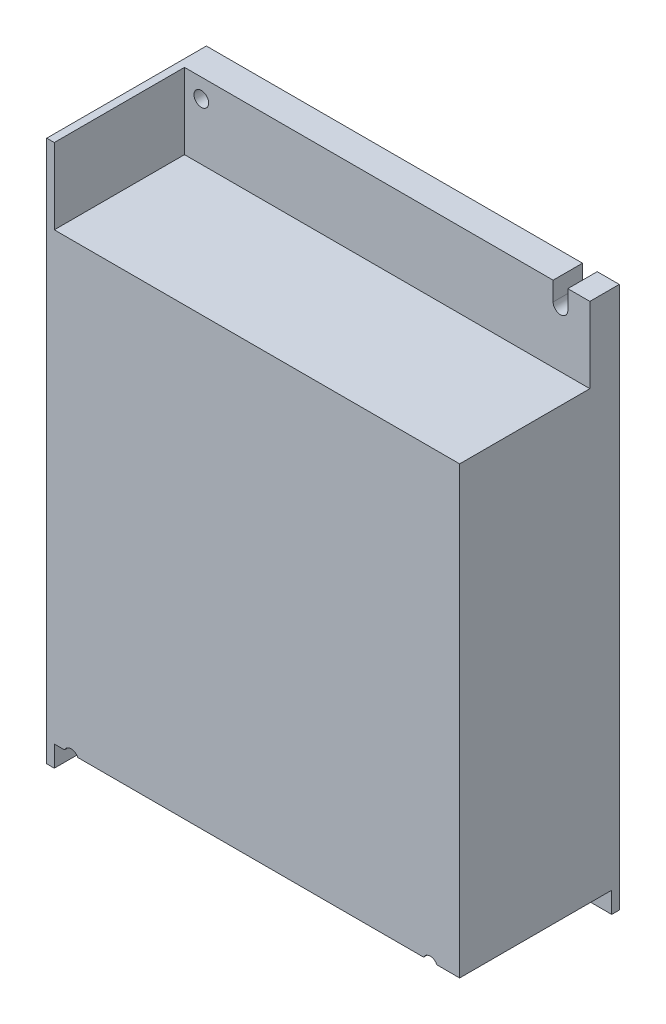
ISO-10303-21;
HEADER;
FILE_DESCRIPTION(('STEP AP214'),'2;1');
FILE_NAME('part.step','',(''),(''),'','','');
FILE_SCHEMA(('AUTOMOTIVE_DESIGN { 1 0 10303 214 1 1 1 1 }'));
ENDSEC;
DATA;
#1=APPLICATION_CONTEXT('core data for automotive mechanical design processes');
#2=APPLICATION_PROTOCOL_DEFINITION('international standard','automotive_design',2000,#1);
#3=PRODUCT_CONTEXT('',#1,'mechanical');
#4=PRODUCT('Part','Part','',(#3));
#5=PRODUCT_RELATED_PRODUCT_CATEGORY('part','',(#4));
#6=PRODUCT_DEFINITION_FORMATION('','',#4);
#7=PRODUCT_DEFINITION_CONTEXT('part definition',#1,'design');
#8=PRODUCT_DEFINITION('design','',#6,#7);
#9=PRODUCT_DEFINITION_SHAPE('','',#8);
#10=(LENGTH_UNIT() NAMED_UNIT(*) SI_UNIT(.MILLI.,.METRE.));
#11=(NAMED_UNIT(*) PLANE_ANGLE_UNIT() SI_UNIT($,.RADIAN.));
#12=(NAMED_UNIT(*) SI_UNIT($,.STERADIAN.) SOLID_ANGLE_UNIT());
#13=UNCERTAINTY_MEASURE_WITH_UNIT(LENGTH_MEASURE(1.E-05),#10,'distance_accuracy_value','');
#14=(GEOMETRIC_REPRESENTATION_CONTEXT(3) GLOBAL_UNCERTAINTY_ASSIGNED_CONTEXT((#13)) GLOBAL_UNIT_ASSIGNED_CONTEXT((#10,
#11,#12)) REPRESENTATION_CONTEXT('',''));
#15=CARTESIAN_POINT('',(0.,0.,0.));
#16=DIRECTION('',(0.,0.,1.));
#17=DIRECTION('',(1.,0.,0.));
#18=AXIS2_PLACEMENT_3D('',#15,#16,#17);
#19=CARTESIAN_POINT('',(-47.35,-59.5,-96.6294468575703));
#20=DIRECTION('',(0.,1.,0.));
#21=DIRECTION('',(-1.,0.,0.));
#22=AXIS2_PLACEMENT_3D('',#19,#20,#21);
#23=PLANE('',#22);
#24=DIRECTION('',(-1.,0.,0.));
#25=VECTOR('',#24,1.);
#26=CARTESIAN_POINT('',(-47.35,-59.5,38.));
#27=LINE('',#26,#25);
#28=CARTESIAN_POINT('',(40.5688611699158,-59.5,38.));
#29=VERTEX_POINT('',#28);
#30=CARTESIAN_POINT('',(-41.7688611699158,-59.5,38.));
#31=VERTEX_POINT('',#30);
#32=EDGE_CURVE('E315',#29,#31,#27,.T.);
#33=ORIENTED_EDGE('',*,*,#32,.T.);
#34=DIRECTION('',(0.,0.,-1.));
#35=VECTOR('',#34,1.);
#36=CARTESIAN_POINT('',(-41.7688611699158,-59.5,38.));
#37=LINE('',#36,#35);
#38=CARTESIAN_POINT('',(-41.7688611699158,-59.5,1.8));
#39=VERTEX_POINT('',#38);
#40=EDGE_CURVE('E12',#31,#39,#37,.T.);
#41=ORIENTED_EDGE('',*,*,#40,.T.);
#42=DIRECTION('',(1.,0.,0.));
#43=VECTOR('',#42,1.);
#44=CARTESIAN_POINT('',(-47.35,-59.5,1.8));
#45=LINE('',#44,#43);
#46=CARTESIAN_POINT('',(40.5688611699158,-59.5,1.8));
#47=VERTEX_POINT('',#46);
#48=EDGE_CURVE('E305',#39,#47,#45,.T.);
#49=ORIENTED_EDGE('',*,*,#48,.T.);
#50=DIRECTION('',(0.,0.,-1.));
#51=VECTOR('',#50,1.);
#52=CARTESIAN_POINT('',(40.5688611699158,-59.5,38.));
#53=LINE('',#52,#51);
#54=EDGE_CURVE('E280',#47,#29,#53,.F.);
#55=ORIENTED_EDGE('',*,*,#54,.T.);
#56=EDGE_LOOP('',(#33,#41,#49,#55));
#57=FACE_BOUND('',#56,.T.);
#58=ADVANCED_FACE('F37',(#57),#23,.F.);
#59=CARTESIAN_POINT('',(-49.15,64.5,38.));
#60=DIRECTION('',(0.,-1.,0.));
#61=DIRECTION('',(0.,0.,-1.));
#62=AXIS2_PLACEMENT_3D('',#59,#60,#61);
#63=PLANE('',#62);
#64=DIRECTION('',(-1.,0.,0.));
#65=VECTOR('',#64,1.);
#66=CARTESIAN_POINT('',(-49.15,64.5,0.));
#67=LINE('',#66,#65);
#68=CARTESIAN_POINT('',(49.15,64.5,0.));
#69=VERTEX_POINT('',#68);
#70=CARTESIAN_POINT('',(43.9,64.5,0.));
#71=VERTEX_POINT('',#70);
#72=EDGE_CURVE('E364',#69,#71,#67,.T.);
#73=ORIENTED_EDGE('',*,*,#72,.T.);
#74=DIRECTION('',(0.,0.,-1.));
#75=VECTOR('',#74,1.);
#76=CARTESIAN_POINT('',(43.9,64.5,38.));
#77=LINE('',#76,#75);
#78=CARTESIAN_POINT('',(43.9,64.5,7.));
#79=VERTEX_POINT('',#78);
#80=EDGE_CURVE('E261',#79,#71,#77,.T.);
#81=ORIENTED_EDGE('',*,*,#80,.F.);
#82=DIRECTION('',(1.,0.,0.));
#83=VECTOR('',#82,1.);
#84=CARTESIAN_POINT('',(-47.35,64.5,7.00000000000001));
#85=LINE('',#84,#83);
#86=CARTESIAN_POINT('',(49.15,64.5,7.00000000000001));
#87=VERTEX_POINT('',#86);
#88=EDGE_CURVE('E329',#79,#87,#85,.T.);
#89=ORIENTED_EDGE('',*,*,#88,.T.);
#90=DIRECTION('',(0.,0.,-1.));
#91=VECTOR('',#90,1.);
#92=CARTESIAN_POINT('',(49.15,64.5,38.));
#93=LINE('',#92,#91);
#94=EDGE_CURVE('E380',#87,#69,#93,.T.);
#95=ORIENTED_EDGE('',*,*,#94,.T.);
#96=EDGE_LOOP('',(#73,#81,#89,#95));
#97=FACE_BOUND('',#96,.T.);
#98=ADVANCED_FACE('F485',(#97),#63,.F.);
#99=CARTESIAN_POINT('',(-49.15,-64.5,38.));
#100=DIRECTION('',(0.,1.,0.));
#101=DIRECTION('',(0.,0.,1.));
#102=AXIS2_PLACEMENT_3D('',#99,#100,#101);
#103=PLANE('',#102);
#104=DIRECTION('',(1.,0.,0.));
#105=VECTOR('',#104,1.);
#106=CARTESIAN_POINT('',(-49.15,-64.5,0.));
#107=LINE('',#106,#105);
#108=CARTESIAN_POINT('',(-49.15,-64.5,0.));
#109=VERTEX_POINT('',#108);
#110=CARTESIAN_POINT('',(40.4,-64.5,0.));
#111=VERTEX_POINT('',#110);
#112=EDGE_CURVE('E353',#109,#111,#107,.T.);
#113=ORIENTED_EDGE('',*,*,#112,.T.);
#114=DIRECTION('',(0.,0.,-1.));
#115=VECTOR('',#114,1.);
#116=CARTESIAN_POINT('',(40.4,-64.5,38.));
#117=LINE('',#116,#115);
#118=CARTESIAN_POINT('',(40.4,-64.5,1.8));
#119=VERTEX_POINT('',#118);
#120=EDGE_CURVE('E281',#119,#111,#117,.T.);
#121=ORIENTED_EDGE('',*,*,#120,.F.);
#122=DIRECTION('',(-1.,0.,0.));
#123=VECTOR('',#122,1.);
#124=CARTESIAN_POINT('',(-47.35,-64.5,1.8));
#125=LINE('',#124,#123);
#126=CARTESIAN_POINT('',(-47.35,-64.5,1.8));
#127=VERTEX_POINT('',#126);
#128=EDGE_CURVE('E307',#119,#127,#125,.T.);
#129=ORIENTED_EDGE('',*,*,#128,.T.);
#130=DIRECTION('',(0.,0.,1.));
#131=VECTOR('',#130,1.);
#132=CARTESIAN_POINT('',(-47.35,-64.5,-96.6294468575703));
#133=LINE('',#132,#131);
#134=CARTESIAN_POINT('',(-47.35,-64.5,38.));
#135=VERTEX_POINT('',#134);
#136=EDGE_CURVE('E314',#127,#135,#133,.T.);
#137=ORIENTED_EDGE('',*,*,#136,.T.);
#138=DIRECTION('',(1.,0.,0.));
#139=VECTOR('',#138,1.);
#140=CARTESIAN_POINT('',(-49.15,-64.5,38.));
#141=LINE('',#140,#139);
#142=CARTESIAN_POINT('',(-49.15,-64.5,38.));
#143=VERTEX_POINT('',#142);
#144=EDGE_CURVE('E357',#143,#135,#141,.T.);
#145=ORIENTED_EDGE('',*,*,#144,.F.);
#146=DIRECTION('',(0.,0.,-1.));
#147=VECTOR('',#146,1.);
#148=CARTESIAN_POINT('',(-49.15,-64.5,38.));
#149=LINE('',#148,#147);
#150=EDGE_CURVE('E374',#143,#109,#149,.T.);
#151=ORIENTED_EDGE('',*,*,#150,.T.);
#152=EDGE_LOOP('',(#113,#121,#129,#137,#145,#151));
#153=FACE_BOUND('',#152,.T.);
#154=ADVANCED_FACE('F442',(#153),#103,.F.);
#155=CARTESIAN_POINT('',(49.15,-59.5,38.));
#156=VERTEX_POINT('',#155);
#157=CARTESIAN_POINT('',(43.7311388300842,-59.5,38.));
#158=VERTEX_POINT('',#157);
#159=EDGE_CURVE('E311',#156,#158,#27,.T.);
#160=ORIENTED_EDGE('',*,*,#159,.T.);
#161=DIRECTION('',(0.,0.,-1.));
#162=VECTOR('',#161,1.);
#163=CARTESIAN_POINT('',(43.7311388300842,-59.5,38.));
#164=LINE('',#163,#162);
#165=CARTESIAN_POINT('',(43.7311388300842,-59.5,1.8));
#166=VERTEX_POINT('',#165);
#167=EDGE_CURVE('E289',#158,#166,#164,.T.);
#168=ORIENTED_EDGE('',*,*,#167,.T.);
#169=CARTESIAN_POINT('',(49.15,-59.5,1.8));
#170=VERTEX_POINT('',#169);
#171=EDGE_CURVE('E299',#166,#170,#45,.T.);
#172=ORIENTED_EDGE('',*,*,#171,.T.);
#173=DIRECTION('',(0.,0.,1.));
#174=VECTOR('',#173,1.);
#175=CARTESIAN_POINT('',(49.15,-59.5,-96.6294468575703));
#176=LINE('',#175,#174);
#177=EDGE_CURVE('E318',#170,#156,#176,.T.);
#178=ORIENTED_EDGE('',*,*,#177,.T.);
#179=EDGE_LOOP('',(#160,#168,#172,#178));
#180=FACE_BOUND('',#179,.T.);
#181=ADVANCED_FACE('F413',(#180),#23,.F.);
#182=CARTESIAN_POINT('',(0.,0.,1.8));
#183=DIRECTION('',(0.,0.,1.));
#184=DIRECTION('',(1.,0.,0.));
#185=AXIS2_PLACEMENT_3D('',#182,#183,#184);
#186=PLANE('',#185);
#187=CARTESIAN_POINT('',(-43.35,-60.25,1.8));
#188=DIRECTION('',(0.,0.,1.));
#189=DIRECTION('',(1.,0.,0.));
#190=AXIS2_PLACEMENT_3D('',#187,#188,#189);
#191=CIRCLE('',#190,1.75);
#192=CARTESIAN_POINT('',(-41.6,-60.25,1.8));
#193=VERTEX_POINT('',#192);
#194=EDGE_CURVE('E242',#193,#39,#191,.T.);
#195=ORIENTED_EDGE('',*,*,#194,.F.);
#196=DIRECTION('',(0.,1.,0.));
#197=VECTOR('',#196,1.);
#198=CARTESIAN_POINT('',(-41.6,0.,1.8));
#199=LINE('',#198,#197);
#200=CARTESIAN_POINT('',(-41.6,-61.5,1.8));
#201=VERTEX_POINT('',#200);
#202=EDGE_CURVE('E245',#201,#193,#199,.T.);
#203=ORIENTED_EDGE('',*,*,#202,.F.);
#204=CARTESIAN_POINT('',(-43.35,-61.5,1.8));
#205=DIRECTION('',(0.,0.,1.));
#206=DIRECTION('',(1.,0.,0.));
#207=AXIS2_PLACEMENT_3D('',#204,#205,#206);
#208=CIRCLE('',#207,1.75);
#209=CARTESIAN_POINT('',(-45.1,-61.5,1.8));
#210=VERTEX_POINT('',#209);
#211=EDGE_CURVE('E247',#210,#201,#208,.T.);
#212=ORIENTED_EDGE('',*,*,#211,.F.);
#213=DIRECTION('',(0.,-1.,0.));
#214=VECTOR('',#213,1.);
#215=CARTESIAN_POINT('',(-45.1,0.,1.8));
#216=LINE('',#215,#214);
#217=CARTESIAN_POINT('',(-45.1,-60.25,1.8));
#218=VERTEX_POINT('',#217);
#219=EDGE_CURVE('E243',#218,#210,#216,.T.);
#220=ORIENTED_EDGE('',*,*,#219,.F.);
#221=CARTESIAN_POINT('',(-44.9311388300842,-59.5,1.8));
#222=VERTEX_POINT('',#221);
#223=EDGE_CURVE('E218',#222,#218,#191,.T.);
#224=ORIENTED_EDGE('',*,*,#223,.F.);
#225=CARTESIAN_POINT('',(-47.35,-59.5,1.8));
#226=VERTEX_POINT('',#225);
#227=EDGE_CURVE('E301',#226,#222,#45,.T.);
#228=ORIENTED_EDGE('',*,*,#227,.F.);
#229=DIRECTION('',(0.,1.,0.));
#230=VECTOR('',#229,1.);
#231=CARTESIAN_POINT('',(-47.35,-59.5,1.8));
#232=LINE('',#231,#230);
#233=EDGE_CURVE('E304',#127,#226,#232,.T.);
#234=ORIENTED_EDGE('',*,*,#233,.F.);
#235=ORIENTED_EDGE('',*,*,#128,.F.);
#236=DIRECTION('',(0.,-1.,0.));
#237=VECTOR('',#236,1.);
#238=CARTESIAN_POINT('',(40.4,0.,1.8));
#239=LINE('',#238,#237);
#240=CARTESIAN_POINT('',(40.4,-60.25,1.8));
#241=VERTEX_POINT('',#240);
#242=EDGE_CURVE('E388',#241,#119,#239,.T.);
#243=ORIENTED_EDGE('',*,*,#242,.F.);
#244=CARTESIAN_POINT('',(42.15,-60.25,1.8));
#245=DIRECTION('',(0.,0.,1.));
#246=DIRECTION('',(1.,0.,0.));
#247=AXIS2_PLACEMENT_3D('',#244,#245,#246);
#248=CIRCLE('',#247,1.75);
#249=EDGE_CURVE('E389',#47,#241,#248,.T.);
#250=ORIENTED_EDGE('',*,*,#249,.F.);
#251=ORIENTED_EDGE('',*,*,#48,.F.);
#252=EDGE_LOOP('',(#195,#203,#212,#220,#224,#228,#234,#235,#243,#250,#251));
#253=FACE_BOUND('',#252,.T.);
#254=ADVANCED_FACE('F452',(#253),#186,.T.);
#255=CARTESIAN_POINT('',(49.15,64.5,38.));
#256=DIRECTION('',(-1.,0.,0.));
#257=DIRECTION('',(0.,-1.,0.));
#258=AXIS2_PLACEMENT_3D('',#255,#256,#257);
#259=PLANE('',#258);
#260=DIRECTION('',(0.,1.,0.));
#261=VECTOR('',#260,1.);
#262=CARTESIAN_POINT('',(49.15,64.5,38.));
#263=LINE('',#262,#261);
#264=CARTESIAN_POINT('',(49.15,46.5,38.));
#265=VERTEX_POINT('',#264);
#266=EDGE_CURVE('E350',#156,#265,#263,.T.);
#267=ORIENTED_EDGE('',*,*,#266,.F.);
#268=ORIENTED_EDGE('',*,*,#177,.F.);
#269=DIRECTION('',(0.,-1.,0.));
#270=VECTOR('',#269,1.);
#271=CARTESIAN_POINT('',(49.15,-59.5,1.8));
#272=LINE('',#271,#270);
#273=CARTESIAN_POINT('',(49.15,-64.5,1.8));
#274=VERTEX_POINT('',#273);
#275=EDGE_CURVE('E296',#170,#274,#272,.T.);
#276=ORIENTED_EDGE('',*,*,#275,.T.);
#277=DIRECTION('',(0.,0.,-1.));
#278=VECTOR('',#277,1.);
#279=CARTESIAN_POINT('',(49.15,-64.5,38.));
#280=LINE('',#279,#278);
#281=CARTESIAN_POINT('',(49.15,-64.5,0.));
#282=VERTEX_POINT('',#281);
#283=EDGE_CURVE('E360',#274,#282,#280,.T.);
#284=ORIENTED_EDGE('',*,*,#283,.T.);
#285=DIRECTION('',(0.,1.,0.));
#286=VECTOR('',#285,1.);
#287=CARTESIAN_POINT('',(49.15,64.5,0.));
#288=LINE('',#287,#286);
#289=EDGE_CURVE('E349',#282,#69,#288,.T.);
#290=ORIENTED_EDGE('',*,*,#289,.T.);
#291=ORIENTED_EDGE('',*,*,#94,.F.);
#292=DIRECTION('',(0.,-1.,0.));
#293=VECTOR('',#292,1.);
#294=CARTESIAN_POINT('',(49.15,64.5,7.00000000000001));
#295=LINE('',#294,#293);
#296=CARTESIAN_POINT('',(49.15,46.5,7.00000000000001));
#297=VERTEX_POINT('',#296);
#298=EDGE_CURVE('E326',#87,#297,#295,.T.);
#299=ORIENTED_EDGE('',*,*,#298,.T.);
#300=DIRECTION('',(0.,0.,1.));
#301=VECTOR('',#300,1.);
#302=CARTESIAN_POINT('',(49.15,46.5,-98.1644029167397));
#303=LINE('',#302,#301);
#304=EDGE_CURVE('E343',#297,#265,#303,.T.);
#305=ORIENTED_EDGE('',*,*,#304,.T.);
#306=EDGE_LOOP('',(#267,#268,#276,#284,#290,#291,#299,#305));
#307=FACE_BOUND('',#306,.T.);
#308=ADVANCED_FACE('F39',(#307),#259,.F.);
#309=CARTESIAN_POINT('',(-47.35,64.5,7.00000000000001));
#310=VERTEX_POINT('',#309);
#311=CARTESIAN_POINT('',(40.4,64.5,7.00000000000001));
#312=VERTEX_POINT('',#311);
#313=EDGE_CURVE('E331',#310,#312,#85,.T.);
#314=ORIENTED_EDGE('',*,*,#313,.T.);
#315=DIRECTION('',(0.,0.,-1.));
#316=VECTOR('',#315,1.);
#317=CARTESIAN_POINT('',(40.4,64.5,38.));
#318=LINE('',#317,#316);
#319=CARTESIAN_POINT('',(40.4,64.5,0.));
#320=VERTEX_POINT('',#319);
#321=EDGE_CURVE('E263',#312,#320,#318,.T.);
#322=ORIENTED_EDGE('',*,*,#321,.T.);
#323=CARTESIAN_POINT('',(-49.15,64.5,0.));
#324=VERTEX_POINT('',#323);
#325=EDGE_CURVE('E363',#320,#324,#67,.T.);
#326=ORIENTED_EDGE('',*,*,#325,.T.);
#327=DIRECTION('',(0.,0.,-1.));
#328=VECTOR('',#327,1.);
#329=CARTESIAN_POINT('',(-49.15,64.5,38.));
#330=LINE('',#329,#328);
#331=CARTESIAN_POINT('',(-49.15,64.5,38.));
#332=VERTEX_POINT('',#331);
#333=EDGE_CURVE('E377',#332,#324,#330,.T.);
#334=ORIENTED_EDGE('',*,*,#333,.F.);
#335=DIRECTION('',(-1.,0.,0.));
#336=VECTOR('',#335,1.);
#337=CARTESIAN_POINT('',(-49.15,64.5,38.));
#338=LINE('',#337,#336);
#339=CARTESIAN_POINT('',(-47.35,64.5,38.));
#340=VERTEX_POINT('',#339);
#341=EDGE_CURVE('E352',#340,#332,#338,.T.);
#342=ORIENTED_EDGE('',*,*,#341,.F.);
#343=DIRECTION('',(0.,0.,1.));
#344=VECTOR('',#343,1.);
#345=CARTESIAN_POINT('',(-47.35,64.5,-98.1644029167397));
#346=LINE('',#345,#344);
#347=EDGE_CURVE('E330',#310,#340,#346,.T.);
#348=ORIENTED_EDGE('',*,*,#347,.F.);
#349=EDGE_LOOP('',(#314,#322,#326,#334,#342,#348));
#350=FACE_BOUND('',#349,.T.);
#351=ADVANCED_FACE('F433',(#350),#63,.F.);
#352=CARTESIAN_POINT('',(-49.15,64.5,38.));
#353=DIRECTION('',(1.,0.,0.));
#354=DIRECTION('',(0.,1.,0.));
#355=AXIS2_PLACEMENT_3D('',#352,#353,#354);
#356=PLANE('',#355);
#357=DIRECTION('',(0.,-1.,0.));
#358=VECTOR('',#357,1.);
#359=CARTESIAN_POINT('',(-49.15,64.5,0.));
#360=LINE('',#359,#358);
#361=EDGE_CURVE('E367',#324,#109,#360,.T.);
#362=ORIENTED_EDGE('',*,*,#361,.T.);
#363=ORIENTED_EDGE('',*,*,#150,.F.);
#364=DIRECTION('',(0.,-1.,0.));
#365=VECTOR('',#364,1.);
#366=CARTESIAN_POINT('',(-49.15,64.5,38.));
#367=LINE('',#366,#365);
#368=EDGE_CURVE('E355',#332,#143,#367,.T.);
#369=ORIENTED_EDGE('',*,*,#368,.F.);
#370=ORIENTED_EDGE('',*,*,#333,.T.);
#371=EDGE_LOOP('',(#362,#363,#369,#370));
#372=FACE_BOUND('',#371,.T.);
#373=ADVANCED_FACE('F439',(#372),#356,.F.);
#374=CARTESIAN_POINT('',(43.9,-64.5,1.8));
#375=VERTEX_POINT('',#374);
#376=EDGE_CURVE('E322',#274,#375,#125,.T.);
#377=ORIENTED_EDGE('',*,*,#376,.T.);
#378=DIRECTION('',(0.,0.,-1.));
#379=VECTOR('',#378,1.);
#380=CARTESIAN_POINT('',(43.9,-64.5,38.));
#381=LINE('',#380,#379);
#382=CARTESIAN_POINT('',(43.9,-64.5,0.));
#383=VERTEX_POINT('',#382);
#384=EDGE_CURVE('E283',#375,#383,#381,.T.);
#385=ORIENTED_EDGE('',*,*,#384,.T.);
#386=EDGE_CURVE('E369',#383,#282,#107,.T.);
#387=ORIENTED_EDGE('',*,*,#386,.T.);
#388=ORIENTED_EDGE('',*,*,#283,.F.);
#389=EDGE_LOOP('',(#377,#385,#387,#388));
#390=FACE_BOUND('',#389,.T.);
#391=ADVANCED_FACE('F478',(#390),#103,.F.);
#392=CARTESIAN_POINT('',(0.,0.,38.));
#393=DIRECTION('',(0.,0.,1.));
#394=DIRECTION('',(1.,0.,0.));
#395=AXIS2_PLACEMENT_3D('',#392,#393,#394);
#396=PLANE('',#395);
#397=CARTESIAN_POINT('',(-43.35,-60.25,38.));
#398=DIRECTION('',(0.,0.,-1.));
#399=DIRECTION('',(-1.,0.,0.));
#400=AXIS2_PLACEMENT_3D('',#397,#398,#399);
#401=CIRCLE('',#400,1.75);
#402=CARTESIAN_POINT('',(-44.9311388300842,-59.5,38.));
#403=VERTEX_POINT('',#402);
#404=EDGE_CURVE('E60',#403,#31,#401,.T.);
#405=ORIENTED_EDGE('',*,*,#404,.T.);
#406=ORIENTED_EDGE('',*,*,#32,.F.);
#407=CARTESIAN_POINT('',(42.15,-60.25,38.));
#408=DIRECTION('',(0.,0.,-1.));
#409=DIRECTION('',(-1.,0.,0.));
#410=AXIS2_PLACEMENT_3D('',#407,#408,#409);
#411=CIRCLE('',#410,1.75);
#412=EDGE_CURVE('E267',#29,#158,#411,.T.);
#413=ORIENTED_EDGE('',*,*,#412,.T.);
#414=ORIENTED_EDGE('',*,*,#159,.F.);
#415=ORIENTED_EDGE('',*,*,#266,.T.);
#416=DIRECTION('',(1.,0.,0.));
#417=VECTOR('',#416,1.);
#418=CARTESIAN_POINT('',(-47.35,46.5,38.));
#419=LINE('',#418,#417);
#420=CARTESIAN_POINT('',(-47.35,46.5,38.));
#421=VERTEX_POINT('',#420);
#422=EDGE_CURVE('E338',#421,#265,#419,.T.);
#423=ORIENTED_EDGE('',*,*,#422,.F.);
#424=DIRECTION('',(0.,-1.,0.));
#425=VECTOR('',#424,1.);
#426=CARTESIAN_POINT('',(-47.35,64.5,38.));
#427=LINE('',#426,#425);
#428=EDGE_CURVE('E325',#340,#421,#427,.T.);
#429=ORIENTED_EDGE('',*,*,#428,.F.);
#430=ORIENTED_EDGE('',*,*,#341,.T.);
#431=ORIENTED_EDGE('',*,*,#368,.T.);
#432=ORIENTED_EDGE('',*,*,#144,.T.);
#433=DIRECTION('',(0.,-1.,0.));
#434=VECTOR('',#433,1.);
#435=CARTESIAN_POINT('',(-47.35,-59.5,38.));
#436=LINE('',#435,#434);
#437=CARTESIAN_POINT('',(-47.35,-59.5,38.));
#438=VERTEX_POINT('',#437);
#439=EDGE_CURVE('E308',#438,#135,#436,.T.);
#440=ORIENTED_EDGE('',*,*,#439,.F.);
#441=EDGE_CURVE('E310',#403,#438,#27,.T.);
#442=ORIENTED_EDGE('',*,*,#441,.F.);
#443=EDGE_LOOP('',(#405,#406,#413,#414,#415,#423,#429,#430,#431,#432,#440,#442));
#444=FACE_BOUND('',#443,.T.);
#445=ADVANCED_FACE('F403',(#444),#396,.T.);
#446=CARTESIAN_POINT('',(0.,0.,0.));
#447=DIRECTION('',(0.,0.,1.));
#448=DIRECTION('',(1.,0.,0.));
#449=AXIS2_PLACEMENT_3D('',#446,#447,#448);
#450=PLANE('',#449);
#451=DIRECTION('',(0.,1.,0.));
#452=VECTOR('',#451,1.);
#453=CARTESIAN_POINT('',(-45.1,-61.5,0.));
#454=LINE('',#453,#452);
#455=CARTESIAN_POINT('',(-45.1,-61.5,0.));
#456=VERTEX_POINT('',#455);
#457=CARTESIAN_POINT('',(-45.1,-60.25,0.));
#458=VERTEX_POINT('',#457);
#459=EDGE_CURVE('E225',#456,#458,#454,.T.);
#460=ORIENTED_EDGE('',*,*,#459,.F.);
#461=CARTESIAN_POINT('',(-43.35,-61.5,0.));
#462=DIRECTION('',(0.,0.,-1.));
#463=DIRECTION('',(-1.,0.,0.));
#464=AXIS2_PLACEMENT_3D('',#461,#462,#463);
#465=CIRCLE('',#464,1.75);
#466=CARTESIAN_POINT('',(-41.6,-61.5,0.));
#467=VERTEX_POINT('',#466);
#468=EDGE_CURVE('E52',#467,#456,#465,.T.);
#469=ORIENTED_EDGE('',*,*,#468,.F.);
#470=DIRECTION('',(0.,-1.,0.));
#471=VECTOR('',#470,1.);
#472=CARTESIAN_POINT('',(-41.6,-61.5,0.));
#473=LINE('',#472,#471);
#474=CARTESIAN_POINT('',(-41.6,-60.25,0.));
#475=VERTEX_POINT('',#474);
#476=EDGE_CURVE('E232',#475,#467,#473,.T.);
#477=ORIENTED_EDGE('',*,*,#476,.F.);
#478=CARTESIAN_POINT('',(-43.35,-60.25,0.));
#479=DIRECTION('',(0.,0.,-1.));
#480=DIRECTION('',(-1.,0.,0.));
#481=AXIS2_PLACEMENT_3D('',#478,#479,#480);
#482=CIRCLE('',#481,1.75);
#483=EDGE_CURVE('E215',#458,#475,#482,.T.);
#484=ORIENTED_EDGE('',*,*,#483,.F.);
#485=EDGE_LOOP('',(#460,#469,#477,#484));
#486=FACE_BOUND('',#485,.T.);
#487=CARTESIAN_POINT('',(-43.35,60.,0.));
#488=DIRECTION('',(0.,0.,-1.));
#489=DIRECTION('',(-1.,0.,0.));
#490=AXIS2_PLACEMENT_3D('',#487,#488,#489);
#491=CIRCLE('',#490,1.75);
#492=CARTESIAN_POINT('',(-45.1,60.,0.));
#493=VERTEX_POINT('',#492);
#494=EDGE_CURVE('E292',#493,#493,#491,.T.);
#495=ORIENTED_EDGE('',*,*,#494,.F.);
#496=EDGE_LOOP('',(#495));
#497=FACE_BOUND('',#496,.T.);
#498=CARTESIAN_POINT('',(42.15,60.,0.));
#499=DIRECTION('',(0.,0.,-1.));
#500=DIRECTION('',(1.,0.,0.));
#501=AXIS2_PLACEMENT_3D('',#498,#499,#500);
#502=CIRCLE('',#501,1.75);
#503=CARTESIAN_POINT('',(43.9,60.,0.));
#504=VERTEX_POINT('',#503);
#505=CARTESIAN_POINT('',(40.4,60.,0.));
#506=VERTEX_POINT('',#505);
#507=EDGE_CURVE('E249',#504,#506,#502,.T.);
#508=ORIENTED_EDGE('',*,*,#507,.F.);
#509=DIRECTION('',(0.,-1.,0.));
#510=VECTOR('',#509,1.);
#511=CARTESIAN_POINT('',(43.9,64.5,0.));
#512=LINE('',#511,#510);
#513=EDGE_CURVE('E254',#71,#504,#512,.T.);
#514=ORIENTED_EDGE('',*,*,#513,.F.);
#515=ORIENTED_EDGE('',*,*,#72,.F.);
#516=ORIENTED_EDGE('',*,*,#289,.F.);
#517=ORIENTED_EDGE('',*,*,#386,.F.);
#518=DIRECTION('',(0.,-1.,0.));
#519=VECTOR('',#518,1.);
#520=CARTESIAN_POINT('',(43.9,-64.5,0.));
#521=LINE('',#520,#519);
#522=CARTESIAN_POINT('',(43.9,-60.25,0.));
#523=VERTEX_POINT('',#522);
#524=EDGE_CURVE('E274',#523,#383,#521,.T.);
#525=ORIENTED_EDGE('',*,*,#524,.F.);
#526=CARTESIAN_POINT('',(42.15,-60.25,0.));
#527=DIRECTION('',(0.,0.,-1.));
#528=DIRECTION('',(-1.,0.,0.));
#529=AXIS2_PLACEMENT_3D('',#526,#527,#528);
#530=CIRCLE('',#529,1.75);
#531=CARTESIAN_POINT('',(40.4,-60.25,0.));
#532=VERTEX_POINT('',#531);
#533=EDGE_CURVE('E260',#532,#523,#530,.T.);
#534=ORIENTED_EDGE('',*,*,#533,.F.);
#535=DIRECTION('',(0.,1.,0.));
#536=VECTOR('',#535,1.);
#537=CARTESIAN_POINT('',(40.4,-60.25,0.));
#538=LINE('',#537,#536);
#539=EDGE_CURVE('E271',#111,#532,#538,.T.);
#540=ORIENTED_EDGE('',*,*,#539,.F.);
#541=ORIENTED_EDGE('',*,*,#112,.F.);
#542=ORIENTED_EDGE('',*,*,#361,.F.);
#543=ORIENTED_EDGE('',*,*,#325,.F.);
#544=DIRECTION('',(0.,1.,0.));
#545=VECTOR('',#544,1.);
#546=CARTESIAN_POINT('',(40.4,60.,0.));
#547=LINE('',#546,#545);
#548=EDGE_CURVE('E252',#506,#320,#547,.T.);
#549=ORIENTED_EDGE('',*,*,#548,.F.);
#550=EDGE_LOOP('',(#508,#514,#515,#516,#517,#525,#534,#540,#541,#542,#543,#549));
#551=FACE_BOUND('',#550,.T.);
#552=ADVANCED_FACE('F229',(#486,#497,#551),#450,.F.);
#553=CARTESIAN_POINT('',(-47.35,64.5,-98.1644029167397));
#554=DIRECTION('',(-1.,0.,0.));
#555=DIRECTION('',(0.,-1.,0.));
#556=AXIS2_PLACEMENT_3D('',#553,#554,#555);
#557=PLANE('',#556);
#558=DIRECTION('',(0.,1.,0.));
#559=VECTOR('',#558,1.);
#560=CARTESIAN_POINT('',(-47.35,64.5,7.00000000000001));
#561=LINE('',#560,#559);
#562=CARTESIAN_POINT('',(-47.35,46.5,7.00000000000001));
#563=VERTEX_POINT('',#562);
#564=EDGE_CURVE('E334',#563,#310,#561,.T.);
#565=ORIENTED_EDGE('',*,*,#564,.T.);
#566=ORIENTED_EDGE('',*,*,#347,.T.);
#567=ORIENTED_EDGE('',*,*,#428,.T.);
#568=DIRECTION('',(0.,0.,1.));
#569=VECTOR('',#568,1.);
#570=CARTESIAN_POINT('',(-47.35,46.5,-98.1644029167397));
#571=LINE('',#570,#569);
#572=EDGE_CURVE('E341',#563,#421,#571,.T.);
#573=ORIENTED_EDGE('',*,*,#572,.F.);
#574=EDGE_LOOP('',(#565,#566,#567,#573));
#575=FACE_BOUND('',#574,.T.);
#576=ADVANCED_FACE('F427',(#575),#557,.F.);
#577=CARTESIAN_POINT('',(-47.35,46.5,-98.1644029167397));
#578=DIRECTION('',(0.,-1.,0.));
#579=DIRECTION('',(0.,0.,-1.));
#580=AXIS2_PLACEMENT_3D('',#577,#578,#579);
#581=PLANE('',#580);
#582=DIRECTION('',(-1.,0.,0.));
#583=VECTOR('',#582,1.);
#584=CARTESIAN_POINT('',(-47.35,46.5,7.00000000000001));
#585=LINE('',#584,#583);
#586=EDGE_CURVE('E336',#297,#563,#585,.T.);
#587=ORIENTED_EDGE('',*,*,#586,.T.);
#588=ORIENTED_EDGE('',*,*,#572,.T.);
#589=ORIENTED_EDGE('',*,*,#422,.T.);
#590=ORIENTED_EDGE('',*,*,#304,.F.);
#591=EDGE_LOOP('',(#587,#588,#589,#590));
#592=FACE_BOUND('',#591,.T.);
#593=ADVANCED_FACE('F422',(#592),#581,.F.);
#594=CARTESIAN_POINT('',(0.,0.,7.));
#595=DIRECTION('',(0.,0.,1.));
#596=DIRECTION('',(1.,0.,0.));
#597=AXIS2_PLACEMENT_3D('',#594,#595,#596);
#598=PLANE('',#597);
#599=DIRECTION('',(0.,1.,0.));
#600=VECTOR('',#599,1.);
#601=CARTESIAN_POINT('',(43.9,0.,7.));
#602=LINE('',#601,#600);
#603=CARTESIAN_POINT('',(43.9,60.,7.));
#604=VERTEX_POINT('',#603);
#605=EDGE_CURVE('E395',#604,#79,#602,.T.);
#606=ORIENTED_EDGE('',*,*,#605,.F.);
#607=CARTESIAN_POINT('',(42.15,60.,7.));
#608=DIRECTION('',(0.,0.,1.));
#609=DIRECTION('',(1.,0.,0.));
#610=AXIS2_PLACEMENT_3D('',#607,#608,#609);
#611=CIRCLE('',#610,1.75);
#612=CARTESIAN_POINT('',(40.4,60.,7.));
#613=VERTEX_POINT('',#612);
#614=EDGE_CURVE('E393',#613,#604,#611,.T.);
#615=ORIENTED_EDGE('',*,*,#614,.F.);
#616=DIRECTION('',(0.,-1.,0.));
#617=VECTOR('',#616,1.);
#618=CARTESIAN_POINT('',(40.4,0.,7.));
#619=LINE('',#618,#617);
#620=EDGE_CURVE('E391',#312,#613,#619,.T.);
#621=ORIENTED_EDGE('',*,*,#620,.F.);
#622=ORIENTED_EDGE('',*,*,#313,.F.);
#623=ORIENTED_EDGE('',*,*,#564,.F.);
#624=ORIENTED_EDGE('',*,*,#586,.F.);
#625=ORIENTED_EDGE('',*,*,#298,.F.);
#626=ORIENTED_EDGE('',*,*,#88,.F.);
#627=EDGE_LOOP('',(#606,#615,#621,#622,#623,#624,#625,#626));
#628=FACE_BOUND('',#627,.T.);
#629=CARTESIAN_POINT('',(-43.35,60.,7.));
#630=DIRECTION('',(0.,0.,1.));
#631=DIRECTION('',(1.,0.,0.));
#632=AXIS2_PLACEMENT_3D('',#629,#630,#631);
#633=CIRCLE('',#632,1.75);
#634=CARTESIAN_POINT('',(-41.6,60.,7.));
#635=VERTEX_POINT('',#634);
#636=EDGE_CURVE('E295',#635,#635,#633,.T.);
#637=ORIENTED_EDGE('',*,*,#636,.F.);
#638=EDGE_LOOP('',(#637));
#639=FACE_BOUND('',#638,.T.);
#640=ADVANCED_FACE('F490',(#628,#639),#598,.T.);
#641=CARTESIAN_POINT('',(-47.35,-59.5,-96.6294468575703));
#642=DIRECTION('',(-1.,0.,0.));
#643=DIRECTION('',(0.,0.,1.));
#644=AXIS2_PLACEMENT_3D('',#641,#642,#643);
#645=PLANE('',#644);
#646=ORIENTED_EDGE('',*,*,#233,.T.);
#647=DIRECTION('',(0.,0.,1.));
#648=VECTOR('',#647,1.);
#649=CARTESIAN_POINT('',(-47.35,-59.5,-96.6294468575703));
#650=LINE('',#649,#648);
#651=EDGE_CURVE('E300',#226,#438,#650,.T.);
#652=ORIENTED_EDGE('',*,*,#651,.T.);
#653=ORIENTED_EDGE('',*,*,#439,.T.);
#654=ORIENTED_EDGE('',*,*,#136,.F.);
#655=EDGE_LOOP('',(#646,#652,#653,#654));
#656=FACE_BOUND('',#655,.T.);
#657=ADVANCED_FACE('F449',(#656),#645,.F.);
#658=ORIENTED_EDGE('',*,*,#227,.T.);
#659=DIRECTION('',(0.,0.,-1.));
#660=VECTOR('',#659,1.);
#661=CARTESIAN_POINT('',(-44.9311388300842,-59.5,38.));
#662=LINE('',#661,#660);
#663=EDGE_CURVE('E45',#222,#403,#662,.F.);
#664=ORIENTED_EDGE('',*,*,#663,.T.);
#665=ORIENTED_EDGE('',*,*,#441,.T.);
#666=ORIENTED_EDGE('',*,*,#651,.F.);
#667=EDGE_LOOP('',(#658,#664,#665,#666));
#668=FACE_BOUND('',#667,.T.);
#669=ADVANCED_FACE('F398',(#668),#23,.F.);
#670=CARTESIAN_POINT('',(43.9,-60.25,1.8));
#671=VERTEX_POINT('',#670);
#672=EDGE_CURVE('E386',#671,#166,#248,.T.);
#673=ORIENTED_EDGE('',*,*,#672,.F.);
#674=DIRECTION('',(0.,1.,0.));
#675=VECTOR('',#674,1.);
#676=CARTESIAN_POINT('',(43.9,0.,1.8));
#677=LINE('',#676,#675);
#678=EDGE_CURVE('E382',#375,#671,#677,.T.);
#679=ORIENTED_EDGE('',*,*,#678,.F.);
#680=ORIENTED_EDGE('',*,*,#376,.F.);
#681=ORIENTED_EDGE('',*,*,#275,.F.);
#682=ORIENTED_EDGE('',*,*,#171,.F.);
#683=EDGE_LOOP('',(#673,#679,#680,#681,#682));
#684=FACE_BOUND('',#683,.T.);
#685=ADVANCED_FACE('F476',(#684),#186,.T.);
#686=CARTESIAN_POINT('',(-43.35,60.,38.));
#687=DIRECTION('',(0.,0.,-1.));
#688=DIRECTION('',(-1.,0.,0.));
#689=AXIS2_PLACEMENT_3D('',#686,#687,#688);
#690=CYLINDRICAL_SURFACE('',#689,1.75);
#691=ORIENTED_EDGE('',*,*,#636,.T.);
#692=EDGE_LOOP('',(#691));
#693=FACE_BOUND('',#692,.T.);
#694=ORIENTED_EDGE('',*,*,#494,.T.);
#695=EDGE_LOOP('',(#694));
#696=FACE_BOUND('',#695,.T.);
#697=ADVANCED_FACE('F526',(#693,#696),#690,.F.);
#698=CARTESIAN_POINT('',(42.15,-60.25,38.));
#699=DIRECTION('',(0.,0.,-1.));
#700=DIRECTION('',(-1.,0.,0.));
#701=AXIS2_PLACEMENT_3D('',#698,#699,#700);
#702=CYLINDRICAL_SURFACE('',#701,1.75);
#703=ORIENTED_EDGE('',*,*,#412,.F.);
#704=ORIENTED_EDGE('',*,*,#54,.F.);
#705=ORIENTED_EDGE('',*,*,#249,.T.);
#706=DIRECTION('',(0.,0.,-1.));
#707=VECTOR('',#706,1.);
#708=CARTESIAN_POINT('',(40.4,-60.25,38.));
#709=LINE('',#708,#707);
#710=EDGE_CURVE('E278',#241,#532,#709,.T.);
#711=ORIENTED_EDGE('',*,*,#710,.T.);
#712=ORIENTED_EDGE('',*,*,#533,.T.);
#713=DIRECTION('',(0.,0.,-1.));
#714=VECTOR('',#713,1.);
#715=CARTESIAN_POINT('',(43.9,-60.25,38.));
#716=LINE('',#715,#714);
#717=EDGE_CURVE('E270',#671,#523,#716,.T.);
#718=ORIENTED_EDGE('',*,*,#717,.F.);
#719=ORIENTED_EDGE('',*,*,#672,.T.);
#720=ORIENTED_EDGE('',*,*,#167,.F.);
#721=EDGE_LOOP('',(#703,#704,#705,#711,#712,#718,#719,#720));
#722=FACE_BOUND('',#721,.T.);
#723=ADVANCED_FACE('F461',(#722),#702,.F.);
#724=CARTESIAN_POINT('',(40.4,-60.25,38.));
#725=DIRECTION('',(-1.,0.,0.));
#726=DIRECTION('',(0.,0.,1.));
#727=AXIS2_PLACEMENT_3D('',#724,#725,#726);
#728=PLANE('',#727);
#729=ORIENTED_EDGE('',*,*,#242,.T.);
#730=ORIENTED_EDGE('',*,*,#120,.T.);
#731=ORIENTED_EDGE('',*,*,#539,.T.);
#732=ORIENTED_EDGE('',*,*,#710,.F.);
#733=EDGE_LOOP('',(#729,#730,#731,#732));
#734=FACE_BOUND('',#733,.T.);
#735=ADVANCED_FACE('F464',(#734),#728,.F.);
#736=CARTESIAN_POINT('',(43.9,-64.5,38.));
#737=DIRECTION('',(1.,0.,0.));
#738=DIRECTION('',(0.,0.,-1.));
#739=AXIS2_PLACEMENT_3D('',#736,#737,#738);
#740=PLANE('',#739);
#741=ORIENTED_EDGE('',*,*,#678,.T.);
#742=ORIENTED_EDGE('',*,*,#717,.T.);
#743=ORIENTED_EDGE('',*,*,#524,.T.);
#744=ORIENTED_EDGE('',*,*,#384,.F.);
#745=EDGE_LOOP('',(#741,#742,#743,#744));
#746=FACE_BOUND('',#745,.T.);
#747=ADVANCED_FACE('F510',(#746),#740,.F.);
#748=CARTESIAN_POINT('',(42.15,60.,38.));
#749=DIRECTION('',(0.,0.,-1.));
#750=DIRECTION('',(-1.,0.,0.));
#751=AXIS2_PLACEMENT_3D('',#748,#749,#750);
#752=CYLINDRICAL_SURFACE('',#751,1.75);
#753=ORIENTED_EDGE('',*,*,#614,.T.);
#754=DIRECTION('',(0.,0.,-1.));
#755=VECTOR('',#754,1.);
#756=CARTESIAN_POINT('',(43.9,60.,38.));
#757=LINE('',#756,#755);
#758=EDGE_CURVE('E258',#604,#504,#757,.T.);
#759=ORIENTED_EDGE('',*,*,#758,.T.);
#760=ORIENTED_EDGE('',*,*,#507,.T.);
#761=DIRECTION('',(0.,0.,-1.));
#762=VECTOR('',#761,1.);
#763=CARTESIAN_POINT('',(40.4,60.,38.));
#764=LINE('',#763,#762);
#765=EDGE_CURVE('E257',#613,#506,#764,.T.);
#766=ORIENTED_EDGE('',*,*,#765,.F.);
#767=EDGE_LOOP('',(#753,#759,#760,#766));
#768=FACE_BOUND('',#767,.T.);
#769=ADVANCED_FACE('F499',(#768),#752,.F.);
#770=CARTESIAN_POINT('',(43.9,64.5,38.));
#771=DIRECTION('',(1.,0.,0.));
#772=DIRECTION('',(0.,0.,-1.));
#773=AXIS2_PLACEMENT_3D('',#770,#771,#772);
#774=PLANE('',#773);
#775=ORIENTED_EDGE('',*,*,#605,.T.);
#776=ORIENTED_EDGE('',*,*,#80,.T.);
#777=ORIENTED_EDGE('',*,*,#513,.T.);
#778=ORIENTED_EDGE('',*,*,#758,.F.);
#779=EDGE_LOOP('',(#775,#776,#777,#778));
#780=FACE_BOUND('',#779,.T.);
#781=ADVANCED_FACE('F502',(#780),#774,.F.);
#782=CARTESIAN_POINT('',(40.4,60.,38.));
#783=DIRECTION('',(-1.,0.,0.));
#784=DIRECTION('',(0.,0.,1.));
#785=AXIS2_PLACEMENT_3D('',#782,#783,#784);
#786=PLANE('',#785);
#787=ORIENTED_EDGE('',*,*,#620,.T.);
#788=ORIENTED_EDGE('',*,*,#765,.T.);
#789=ORIENTED_EDGE('',*,*,#548,.T.);
#790=ORIENTED_EDGE('',*,*,#321,.F.);
#791=EDGE_LOOP('',(#787,#788,#789,#790));
#792=FACE_BOUND('',#791,.T.);
#793=ADVANCED_FACE('F496',(#792),#786,.F.);
#794=CARTESIAN_POINT('',(-43.35,-61.5,38.));
#795=DIRECTION('',(0.,0.,-1.));
#796=DIRECTION('',(-1.,0.,0.));
#797=AXIS2_PLACEMENT_3D('',#794,#795,#796);
#798=CYLINDRICAL_SURFACE('',#797,1.75);
#799=ORIENTED_EDGE('',*,*,#211,.T.);
#800=DIRECTION('',(0.,0.,-1.));
#801=VECTOR('',#800,1.);
#802=CARTESIAN_POINT('',(-41.6,-61.5,38.));
#803=LINE('',#802,#801);
#804=EDGE_CURVE('E237',#201,#467,#803,.T.);
#805=ORIENTED_EDGE('',*,*,#804,.T.);
#806=ORIENTED_EDGE('',*,*,#468,.T.);
#807=DIRECTION('',(0.,0.,-1.));
#808=VECTOR('',#807,1.);
#809=CARTESIAN_POINT('',(-45.1,-61.5,38.));
#810=LINE('',#809,#808);
#811=EDGE_CURVE('E222',#210,#456,#810,.T.);
#812=ORIENTED_EDGE('',*,*,#811,.F.);
#813=EDGE_LOOP('',(#799,#805,#806,#812));
#814=FACE_BOUND('',#813,.T.);
#815=ADVANCED_FACE('F455',(#814),#798,.F.);
#816=CARTESIAN_POINT('',(-41.6,-61.5,38.));
#817=DIRECTION('',(1.,0.,0.));
#818=DIRECTION('',(0.,0.,-1.));
#819=AXIS2_PLACEMENT_3D('',#816,#817,#818);
#820=PLANE('',#819);
#821=ORIENTED_EDGE('',*,*,#202,.T.);
#822=DIRECTION('',(0.,0.,-1.));
#823=VECTOR('',#822,1.);
#824=CARTESIAN_POINT('',(-41.6,-60.25,38.));
#825=LINE('',#824,#823);
#826=EDGE_CURVE('E221',#193,#475,#825,.T.);
#827=ORIENTED_EDGE('',*,*,#826,.T.);
#828=ORIENTED_EDGE('',*,*,#476,.T.);
#829=ORIENTED_EDGE('',*,*,#804,.F.);
#830=EDGE_LOOP('',(#821,#827,#828,#829));
#831=FACE_BOUND('',#830,.T.);
#832=ADVANCED_FACE('F458',(#831),#820,.F.);
#833=CARTESIAN_POINT('',(-43.35,-60.25,38.));
#834=DIRECTION('',(0.,0.,-1.));
#835=DIRECTION('',(-1.,0.,0.));
#836=AXIS2_PLACEMENT_3D('',#833,#834,#835);
#837=CYLINDRICAL_SURFACE('',#836,1.75);
#838=ORIENTED_EDGE('',*,*,#194,.T.);
#839=ORIENTED_EDGE('',*,*,#40,.F.);
#840=ORIENTED_EDGE('',*,*,#404,.F.);
#841=ORIENTED_EDGE('',*,*,#663,.F.);
#842=ORIENTED_EDGE('',*,*,#223,.T.);
#843=DIRECTION('',(0.,0.,-1.));
#844=VECTOR('',#843,1.);
#845=CARTESIAN_POINT('',(-45.1,-60.25,38.));
#846=LINE('',#845,#844);
#847=EDGE_CURVE('E210',#218,#458,#846,.T.);
#848=ORIENTED_EDGE('',*,*,#847,.T.);
#849=ORIENTED_EDGE('',*,*,#483,.T.);
#850=ORIENTED_EDGE('',*,*,#826,.F.);
#851=EDGE_LOOP('',(#838,#839,#840,#841,#842,#848,#849,#850));
#852=FACE_BOUND('',#851,.T.);
#853=ADVANCED_FACE('F212',(#852),#837,.F.);
#854=CARTESIAN_POINT('',(-45.1,-61.5,38.));
#855=DIRECTION('',(-1.,0.,0.));
#856=DIRECTION('',(0.,0.,1.));
#857=AXIS2_PLACEMENT_3D('',#854,#855,#856);
#858=PLANE('',#857);
#859=ORIENTED_EDGE('',*,*,#219,.T.);
#860=ORIENTED_EDGE('',*,*,#811,.T.);
#861=ORIENTED_EDGE('',*,*,#459,.T.);
#862=ORIENTED_EDGE('',*,*,#847,.F.);
#863=EDGE_LOOP('',(#859,#860,#861,#862));
#864=FACE_BOUND('',#863,.T.);
#865=ADVANCED_FACE('F226',(#864),#858,.F.);
#866=CLOSED_SHELL('',(#58,#98,#154,#181,#254,#308,#351,#373,#391,#445,#552,#576,#593,#640,#657,
#669,#685,#697,#723,#735,#747,#769,#781,#793,#815,#832,#853,#865));
#867=MANIFOLD_SOLID_BREP('B2',#866);
#868=ADVANCED_BREP_SHAPE_REPRESENTATION('',(#18,#867),#14);
#869=SHAPE_DEFINITION_REPRESENTATION(#9,#868);
ENDSEC;
END-ISO-10303-21;
